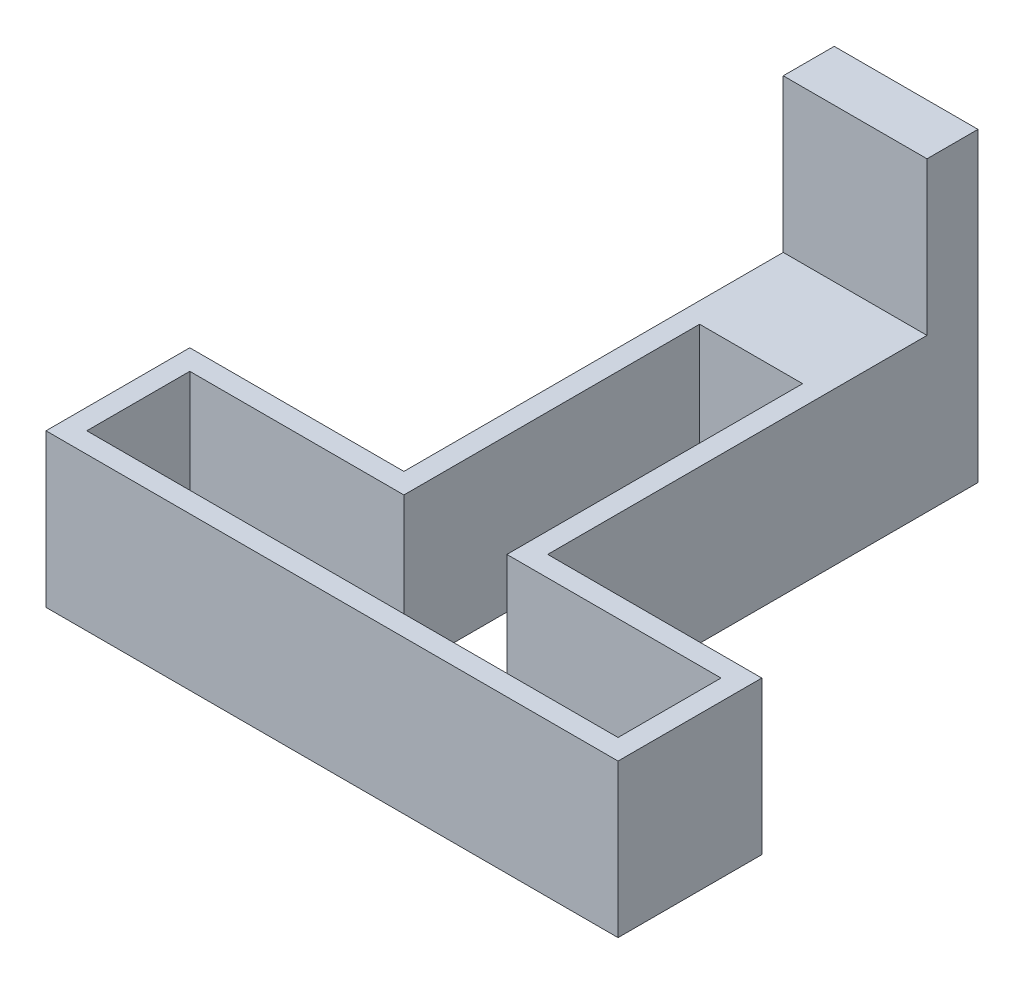
ISO-10303-21;
HEADER;
FILE_DESCRIPTION(('STEP AP214'),'2;1');
FILE_NAME('part.step','',(''),(''),'','','');
FILE_SCHEMA(('AUTOMOTIVE_DESIGN { 1 0 10303 214 1 1 1 1 }'));
ENDSEC;
DATA;
#1=APPLICATION_CONTEXT('core data for automotive mechanical design processes');
#2=APPLICATION_PROTOCOL_DEFINITION('international standard','automotive_design',2000,#1);
#3=PRODUCT_CONTEXT('',#1,'mechanical');
#4=PRODUCT('Part','Part','',(#3));
#5=PRODUCT_RELATED_PRODUCT_CATEGORY('part','',(#4));
#6=PRODUCT_DEFINITION_FORMATION('','',#4);
#7=PRODUCT_DEFINITION_CONTEXT('part definition',#1,'design');
#8=PRODUCT_DEFINITION('design','',#6,#7);
#9=PRODUCT_DEFINITION_SHAPE('','',#8);
#10=(LENGTH_UNIT() NAMED_UNIT(*) SI_UNIT(.MILLI.,.METRE.));
#11=(NAMED_UNIT(*) PLANE_ANGLE_UNIT() SI_UNIT($,.RADIAN.));
#12=(NAMED_UNIT(*) SI_UNIT($,.STERADIAN.) SOLID_ANGLE_UNIT());
#13=UNCERTAINTY_MEASURE_WITH_UNIT(LENGTH_MEASURE(1.E-05),#10,'distance_accuracy_value','');
#14=(GEOMETRIC_REPRESENTATION_CONTEXT(3) GLOBAL_UNCERTAINTY_ASSIGNED_CONTEXT((#13)) GLOBAL_UNIT_ASSIGNED_CONTEXT((#10,
#11,#12)) REPRESENTATION_CONTEXT('',''));
#15=CARTESIAN_POINT('',(0.,0.,0.));
#16=DIRECTION('',(0.,0.,1.));
#17=DIRECTION('',(1.,0.,0.));
#18=AXIS2_PLACEMENT_3D('',#15,#16,#17);
#19=CARTESIAN_POINT('',(0.,15.,0.));
#20=DIRECTION('',(0.,1.,0.));
#21=DIRECTION('',(0.,0.,1.));
#22=AXIS2_PLACEMENT_3D('',#19,#20,#21);
#23=PLANE('',#22);
#24=DIRECTION('',(0.,0.,1.));
#25=VECTOR('',#24,1.);
#26=CARTESIAN_POINT('',(21.,15.,-52.3));
#27=LINE('',#26,#25);
#28=CARTESIAN_POINT('',(21.,15.,-39.1));
#29=VERTEX_POINT('',#28);
#30=CARTESIAN_POINT('',(21.,15.,-10.1));
#31=VERTEX_POINT('',#30);
#32=EDGE_CURVE('E61',#29,#31,#27,.T.);
#33=ORIENTED_EDGE('',*,*,#32,.F.);
#34=DIRECTION('',(-1.,0.,0.));
#35=VECTOR('',#34,1.);
#36=CARTESIAN_POINT('',(19.,15.,-39.1));
#37=LINE('',#36,#35);
#38=CARTESIAN_POINT('',(31.1,15.,-39.1));
#39=VERTEX_POINT('',#38);
#40=EDGE_CURVE('E166',#39,#29,#37,.T.);
#41=ORIENTED_EDGE('',*,*,#40,.F.);
#42=DIRECTION('',(0.,0.,-1.));
#43=VECTOR('',#42,1.);
#44=CARTESIAN_POINT('',(31.1,15.,-10.1));
#45=LINE('',#44,#43);
#46=CARTESIAN_POINT('',(31.1,15.,-10.1));
#47=VERTEX_POINT('',#46);
#48=EDGE_CURVE('E178',#47,#39,#45,.T.);
#49=ORIENTED_EDGE('',*,*,#48,.F.);
#50=DIRECTION('',(-1.,0.,0.));
#51=VECTOR('',#50,1.);
#52=CARTESIAN_POINT('',(52.1,15.,-10.1));
#53=LINE('',#52,#51);
#54=CARTESIAN_POINT('',(52.1,15.,-10.1));
#55=VERTEX_POINT('',#54);
#56=EDGE_CURVE('E184',#55,#47,#53,.T.);
#57=ORIENTED_EDGE('',*,*,#56,.F.);
#58=DIRECTION('',(0.,0.,-1.));
#59=VECTOR('',#58,1.);
#60=CARTESIAN_POINT('',(52.1,15.,0.));
#61=LINE('',#60,#59);
#62=CARTESIAN_POINT('',(52.1,15.,0.));
#63=VERTEX_POINT('',#62);
#64=EDGE_CURVE('E188',#63,#55,#61,.T.);
#65=ORIENTED_EDGE('',*,*,#64,.F.);
#66=DIRECTION('',(1.,0.,0.));
#67=VECTOR('',#66,1.);
#68=CARTESIAN_POINT('',(0.,15.,0.));
#69=LINE('',#68,#67);
#70=CARTESIAN_POINT('',(0.,15.,0.));
#71=VERTEX_POINT('',#70);
#72=EDGE_CURVE('E296',#71,#63,#69,.T.);
#73=ORIENTED_EDGE('',*,*,#72,.F.);
#74=DIRECTION('',(0.,0.,1.));
#75=VECTOR('',#74,1.);
#76=CARTESIAN_POINT('',(0.,15.,-10.1));
#77=LINE('',#76,#75);
#78=CARTESIAN_POINT('',(0.,15.,-10.1));
#79=VERTEX_POINT('',#78);
#80=EDGE_CURVE('E214',#79,#71,#77,.T.);
#81=ORIENTED_EDGE('',*,*,#80,.F.);
#82=DIRECTION('',(-1.,0.,0.));
#83=VECTOR('',#82,1.);
#84=CARTESIAN_POINT('',(21.,15.,-10.1));
#85=LINE('',#84,#83);
#86=EDGE_CURVE('E186',#31,#79,#85,.T.);
#87=ORIENTED_EDGE('',*,*,#86,.F.);
#88=EDGE_LOOP('',(#33,#41,#49,#57,#65,#73,#81,#87));
#89=FACE_BOUND('',#88,.T.);
#90=DIRECTION('',(0.,0.,1.));
#91=VECTOR('',#90,1.);
#92=CARTESIAN_POINT('',(19.,15.,-54.3));
#93=LINE('',#92,#91);
#94=CARTESIAN_POINT('',(19.,15.,-49.3));
#95=VERTEX_POINT('',#94);
#96=CARTESIAN_POINT('',(19.,15.,-12.1));
#97=VERTEX_POINT('',#96);
#98=EDGE_CURVE('E242',#95,#97,#93,.T.);
#99=ORIENTED_EDGE('',*,*,#98,.T.);
#100=DIRECTION('',(-1.,0.,0.));
#101=VECTOR('',#100,1.);
#102=CARTESIAN_POINT('',(19.,15.,-12.1));
#103=LINE('',#102,#101);
#104=CARTESIAN_POINT('',(-2.,15.,-12.1));
#105=VERTEX_POINT('',#104);
#106=EDGE_CURVE('E228',#97,#105,#103,.T.);
#107=ORIENTED_EDGE('',*,*,#106,.T.);
#108=DIRECTION('',(0.,0.,1.));
#109=VECTOR('',#108,1.);
#110=CARTESIAN_POINT('',(-2.,15.,-12.1));
#111=LINE('',#110,#109);
#112=CARTESIAN_POINT('',(-2.,15.,2.));
#113=VERTEX_POINT('',#112);
#114=EDGE_CURVE('E231',#105,#113,#111,.T.);
#115=ORIENTED_EDGE('',*,*,#114,.T.);
#116=DIRECTION('',(1.,0.,0.));
#117=VECTOR('',#116,1.);
#118=CARTESIAN_POINT('',(-2.,15.,2.));
#119=LINE('',#118,#117);
#120=CARTESIAN_POINT('',(54.1,15.,2.));
#121=VERTEX_POINT('',#120);
#122=EDGE_CURVE('E234',#113,#121,#119,.T.);
#123=ORIENTED_EDGE('',*,*,#122,.T.);
#124=DIRECTION('',(0.,0.,-1.));
#125=VECTOR('',#124,1.);
#126=CARTESIAN_POINT('',(54.1,15.,2.));
#127=LINE('',#126,#125);
#128=CARTESIAN_POINT('',(54.1,15.,-12.1));
#129=VERTEX_POINT('',#128);
#130=EDGE_CURVE('E236',#121,#129,#127,.T.);
#131=ORIENTED_EDGE('',*,*,#130,.T.);
#132=DIRECTION('',(-1.,0.,0.));
#133=VECTOR('',#132,1.);
#134=CARTESIAN_POINT('',(54.1,15.,-12.1));
#135=LINE('',#134,#133);
#136=CARTESIAN_POINT('',(33.1,15.,-12.1));
#137=VERTEX_POINT('',#136);
#138=EDGE_CURVE('E238',#129,#137,#135,.T.);
#139=ORIENTED_EDGE('',*,*,#138,.T.);
#140=DIRECTION('',(0.,0.,-1.));
#141=VECTOR('',#140,1.);
#142=CARTESIAN_POINT('',(33.1,15.,-12.1));
#143=LINE('',#142,#141);
#144=CARTESIAN_POINT('',(33.1,15.,-49.3));
#145=VERTEX_POINT('',#144);
#146=EDGE_CURVE('E240',#137,#145,#143,.T.);
#147=ORIENTED_EDGE('',*,*,#146,.T.);
#148=DIRECTION('',(1.,0.,0.));
#149=VECTOR('',#148,1.);
#150=CARTESIAN_POINT('',(19.,15.,-49.3));
#151=LINE('',#150,#149);
#152=EDGE_CURVE('E47',#95,#145,#151,.T.);
#153=ORIENTED_EDGE('',*,*,#152,.F.);
#154=EDGE_LOOP('',(#99,#107,#115,#123,#131,#139,#147,#153));
#155=FACE_BOUND('',#154,.T.);
#156=ADVANCED_FACE('F39',(#89,#155),#23,.T.);
#157=CARTESIAN_POINT('',(0.,0.,0.));
#158=DIRECTION('',(0.,1.,0.));
#159=DIRECTION('',(0.,0.,1.));
#160=AXIS2_PLACEMENT_3D('',#157,#158,#159);
#161=PLANE('',#160);
#162=DIRECTION('',(-1.,0.,0.));
#163=VECTOR('',#162,1.);
#164=CARTESIAN_POINT('',(19.,0.,-39.1));
#165=LINE('',#164,#163);
#166=CARTESIAN_POINT('',(31.1,0.,-39.1));
#167=VERTEX_POINT('',#166);
#168=CARTESIAN_POINT('',(21.,0.,-39.1));
#169=VERTEX_POINT('',#168);
#170=EDGE_CURVE('E168',#167,#169,#165,.T.);
#171=ORIENTED_EDGE('',*,*,#170,.T.);
#172=DIRECTION('',(0.,0.,1.));
#173=VECTOR('',#172,1.);
#174=CARTESIAN_POINT('',(21.,0.,-52.3));
#175=LINE('',#174,#173);
#176=CARTESIAN_POINT('',(21.,0.,-10.1));
#177=VERTEX_POINT('',#176);
#178=EDGE_CURVE('E209',#169,#177,#175,.T.);
#179=ORIENTED_EDGE('',*,*,#178,.T.);
#180=DIRECTION('',(-1.,0.,0.));
#181=VECTOR('',#180,1.);
#182=CARTESIAN_POINT('',(21.,0.,-10.1));
#183=LINE('',#182,#181);
#184=CARTESIAN_POINT('',(0.,0.,-10.1));
#185=VERTEX_POINT('',#184);
#186=EDGE_CURVE('E211',#177,#185,#183,.T.);
#187=ORIENTED_EDGE('',*,*,#186,.T.);
#188=DIRECTION('',(0.,0.,1.));
#189=VECTOR('',#188,1.);
#190=CARTESIAN_POINT('',(0.,0.,-10.1));
#191=LINE('',#190,#189);
#192=CARTESIAN_POINT('',(0.,0.,0.));
#193=VERTEX_POINT('',#192);
#194=EDGE_CURVE('E194',#185,#193,#191,.T.);
#195=ORIENTED_EDGE('',*,*,#194,.T.);
#196=DIRECTION('',(1.,0.,0.));
#197=VECTOR('',#196,1.);
#198=CARTESIAN_POINT('',(0.,0.,0.));
#199=LINE('',#198,#197);
#200=CARTESIAN_POINT('',(52.1,0.,0.));
#201=VERTEX_POINT('',#200);
#202=EDGE_CURVE('E197',#193,#201,#199,.T.);
#203=ORIENTED_EDGE('',*,*,#202,.T.);
#204=DIRECTION('',(0.,0.,-1.));
#205=VECTOR('',#204,1.);
#206=CARTESIAN_POINT('',(52.1,0.,0.));
#207=LINE('',#206,#205);
#208=CARTESIAN_POINT('',(52.1,0.,-10.1));
#209=VERTEX_POINT('',#208);
#210=EDGE_CURVE('E201',#201,#209,#207,.T.);
#211=ORIENTED_EDGE('',*,*,#210,.T.);
#212=DIRECTION('',(-1.,0.,0.));
#213=VECTOR('',#212,1.);
#214=CARTESIAN_POINT('',(52.1,0.,-10.1));
#215=LINE('',#214,#213);
#216=CARTESIAN_POINT('',(31.1,0.,-10.1));
#217=VERTEX_POINT('',#216);
#218=EDGE_CURVE('E204',#209,#217,#215,.T.);
#219=ORIENTED_EDGE('',*,*,#218,.T.);
#220=DIRECTION('',(0.,0.,-1.));
#221=VECTOR('',#220,1.);
#222=CARTESIAN_POINT('',(31.1,0.,-10.1));
#223=LINE('',#222,#221);
#224=EDGE_CURVE('E207',#217,#167,#223,.T.);
#225=ORIENTED_EDGE('',*,*,#224,.T.);
#226=EDGE_LOOP('',(#171,#179,#187,#195,#203,#211,#219,#225));
#227=FACE_BOUND('',#226,.T.);
#228=DIRECTION('',(-1.,0.,0.));
#229=VECTOR('',#228,1.);
#230=CARTESIAN_POINT('',(19.,0.,-12.1));
#231=LINE('',#230,#229);
#232=CARTESIAN_POINT('',(19.,0.,-12.1));
#233=VERTEX_POINT('',#232);
#234=CARTESIAN_POINT('',(-2.,0.,-12.1));
#235=VERTEX_POINT('',#234);
#236=EDGE_CURVE('E227',#233,#235,#231,.T.);
#237=ORIENTED_EDGE('',*,*,#236,.F.);
#238=DIRECTION('',(0.,0.,1.));
#239=VECTOR('',#238,1.);
#240=CARTESIAN_POINT('',(19.,0.,-54.3));
#241=LINE('',#240,#239);
#242=CARTESIAN_POINT('',(19.,0.,-54.3));
#243=VERTEX_POINT('',#242);
#244=EDGE_CURVE('E232',#243,#233,#241,.T.);
#245=ORIENTED_EDGE('',*,*,#244,.F.);
#246=DIRECTION('',(-1.,0.,0.));
#247=VECTOR('',#246,1.);
#248=CARTESIAN_POINT('',(33.1,0.,-54.3));
#249=LINE('',#248,#247);
#250=CARTESIAN_POINT('',(33.1,0.,-54.3));
#251=VERTEX_POINT('',#250);
#252=EDGE_CURVE('E257',#251,#243,#249,.T.);
#253=ORIENTED_EDGE('',*,*,#252,.F.);
#254=DIRECTION('',(0.,0.,-1.));
#255=VECTOR('',#254,1.);
#256=CARTESIAN_POINT('',(33.1,0.,-12.1));
#257=LINE('',#256,#255);
#258=CARTESIAN_POINT('',(33.1,0.,-12.1));
#259=VERTEX_POINT('',#258);
#260=EDGE_CURVE('E255',#259,#251,#257,.T.);
#261=ORIENTED_EDGE('',*,*,#260,.F.);
#262=DIRECTION('',(-1.,0.,0.));
#263=VECTOR('',#262,1.);
#264=CARTESIAN_POINT('',(54.1,0.,-12.1));
#265=LINE('',#264,#263);
#266=CARTESIAN_POINT('',(54.1,0.,-12.1));
#267=VERTEX_POINT('',#266);
#268=EDGE_CURVE('E253',#267,#259,#265,.T.);
#269=ORIENTED_EDGE('',*,*,#268,.F.);
#270=DIRECTION('',(0.,0.,-1.));
#271=VECTOR('',#270,1.);
#272=CARTESIAN_POINT('',(54.1,0.,2.));
#273=LINE('',#272,#271);
#274=CARTESIAN_POINT('',(54.1,0.,2.));
#275=VERTEX_POINT('',#274);
#276=EDGE_CURVE('E251',#275,#267,#273,.T.);
#277=ORIENTED_EDGE('',*,*,#276,.F.);
#278=DIRECTION('',(1.,0.,0.));
#279=VECTOR('',#278,1.);
#280=CARTESIAN_POINT('',(-2.,0.,2.));
#281=LINE('',#280,#279);
#282=CARTESIAN_POINT('',(-2.,0.,2.));
#283=VERTEX_POINT('',#282);
#284=EDGE_CURVE('E249',#283,#275,#281,.T.);
#285=ORIENTED_EDGE('',*,*,#284,.F.);
#286=DIRECTION('',(0.,0.,1.));
#287=VECTOR('',#286,1.);
#288=CARTESIAN_POINT('',(-2.,0.,-12.1));
#289=LINE('',#288,#287);
#290=EDGE_CURVE('E247',#235,#283,#289,.T.);
#291=ORIENTED_EDGE('',*,*,#290,.F.);
#292=EDGE_LOOP('',(#237,#245,#253,#261,#269,#277,#285,#291));
#293=FACE_BOUND('',#292,.T.);
#294=ADVANCED_FACE('F308',(#227,#293),#161,.F.);
#295=CARTESIAN_POINT('',(19.,15.,-12.1));
#296=DIRECTION('',(0.,0.,1.));
#297=DIRECTION('',(1.,0.,0.));
#298=AXIS2_PLACEMENT_3D('',#295,#296,#297);
#299=PLANE('',#298);
#300=ORIENTED_EDGE('',*,*,#236,.T.);
#301=DIRECTION('',(0.,-1.,0.));
#302=VECTOR('',#301,1.);
#303=CARTESIAN_POINT('',(-2.,15.,-12.1));
#304=LINE('',#303,#302);
#305=EDGE_CURVE('E279',#105,#235,#304,.T.);
#306=ORIENTED_EDGE('',*,*,#305,.F.);
#307=ORIENTED_EDGE('',*,*,#106,.F.);
#308=DIRECTION('',(0.,-1.,0.));
#309=VECTOR('',#308,1.);
#310=CARTESIAN_POINT('',(19.,15.,-12.1));
#311=LINE('',#310,#309);
#312=EDGE_CURVE('E244',#97,#233,#311,.T.);
#313=ORIENTED_EDGE('',*,*,#312,.T.);
#314=EDGE_LOOP('',(#300,#306,#307,#313));
#315=FACE_BOUND('',#314,.T.);
#316=ADVANCED_FACE('F41',(#315),#299,.F.);
#317=CARTESIAN_POINT('',(-2.,15.,-12.1));
#318=DIRECTION('',(1.,0.,0.));
#319=DIRECTION('',(0.,0.,-1.));
#320=AXIS2_PLACEMENT_3D('',#317,#318,#319);
#321=PLANE('',#320);
#322=ORIENTED_EDGE('',*,*,#290,.T.);
#323=DIRECTION('',(0.,-1.,0.));
#324=VECTOR('',#323,1.);
#325=CARTESIAN_POINT('',(-2.,15.,2.));
#326=LINE('',#325,#324);
#327=EDGE_CURVE('E277',#113,#283,#326,.T.);
#328=ORIENTED_EDGE('',*,*,#327,.F.);
#329=ORIENTED_EDGE('',*,*,#114,.F.);
#330=ORIENTED_EDGE('',*,*,#305,.T.);
#331=EDGE_LOOP('',(#322,#328,#329,#330));
#332=FACE_BOUND('',#331,.T.);
#333=ADVANCED_FACE('F355',(#332),#321,.F.);
#334=CARTESIAN_POINT('',(-2.,15.,2.));
#335=DIRECTION('',(0.,0.,-1.));
#336=DIRECTION('',(-1.,0.,0.));
#337=AXIS2_PLACEMENT_3D('',#334,#335,#336);
#338=PLANE('',#337);
#339=ORIENTED_EDGE('',*,*,#284,.T.);
#340=DIRECTION('',(0.,-1.,0.));
#341=VECTOR('',#340,1.);
#342=CARTESIAN_POINT('',(54.1,15.,2.));
#343=LINE('',#342,#341);
#344=EDGE_CURVE('E274',#121,#275,#343,.T.);
#345=ORIENTED_EDGE('',*,*,#344,.F.);
#346=ORIENTED_EDGE('',*,*,#122,.F.);
#347=ORIENTED_EDGE('',*,*,#327,.T.);
#348=EDGE_LOOP('',(#339,#345,#346,#347));
#349=FACE_BOUND('',#348,.T.);
#350=ADVANCED_FACE('F358',(#349),#338,.F.);
#351=CARTESIAN_POINT('',(54.1,15.,2.));
#352=DIRECTION('',(-1.,0.,0.));
#353=DIRECTION('',(0.,0.,1.));
#354=AXIS2_PLACEMENT_3D('',#351,#352,#353);
#355=PLANE('',#354);
#356=ORIENTED_EDGE('',*,*,#276,.T.);
#357=DIRECTION('',(0.,-1.,0.));
#358=VECTOR('',#357,1.);
#359=CARTESIAN_POINT('',(54.1,15.,-12.1));
#360=LINE('',#359,#358);
#361=EDGE_CURVE('E271',#129,#267,#360,.T.);
#362=ORIENTED_EDGE('',*,*,#361,.F.);
#363=ORIENTED_EDGE('',*,*,#130,.F.);
#364=ORIENTED_EDGE('',*,*,#344,.T.);
#365=EDGE_LOOP('',(#356,#362,#363,#364));
#366=FACE_BOUND('',#365,.T.);
#367=ADVANCED_FACE('F363',(#366),#355,.F.);
#368=CARTESIAN_POINT('',(54.1,15.,-12.1));
#369=DIRECTION('',(0.,0.,1.));
#370=DIRECTION('',(1.,0.,0.));
#371=AXIS2_PLACEMENT_3D('',#368,#369,#370);
#372=PLANE('',#371);
#373=ORIENTED_EDGE('',*,*,#268,.T.);
#374=DIRECTION('',(0.,-1.,0.));
#375=VECTOR('',#374,1.);
#376=CARTESIAN_POINT('',(33.1,15.,-12.1));
#377=LINE('',#376,#375);
#378=EDGE_CURVE('E268',#137,#259,#377,.T.);
#379=ORIENTED_EDGE('',*,*,#378,.F.);
#380=ORIENTED_EDGE('',*,*,#138,.F.);
#381=ORIENTED_EDGE('',*,*,#361,.T.);
#382=EDGE_LOOP('',(#373,#379,#380,#381));
#383=FACE_BOUND('',#382,.T.);
#384=ADVANCED_FACE('F367',(#383),#372,.F.);
#385=CARTESIAN_POINT('',(33.1,15.,-12.1));
#386=DIRECTION('',(-1.,0.,0.));
#387=DIRECTION('',(0.,0.,1.));
#388=AXIS2_PLACEMENT_3D('',#385,#386,#387);
#389=PLANE('',#388);
#390=ORIENTED_EDGE('',*,*,#260,.T.);
#391=DIRECTION('',(0.,-1.,0.));
#392=VECTOR('',#391,1.);
#393=CARTESIAN_POINT('',(33.1,15.,-54.3));
#394=LINE('',#393,#392);
#395=CARTESIAN_POINT('',(33.1,30.,-54.3));
#396=VERTEX_POINT('',#395);
#397=EDGE_CURVE('E265',#396,#251,#394,.T.);
#398=ORIENTED_EDGE('',*,*,#397,.F.);
#399=DIRECTION('',(0.,0.,-1.));
#400=VECTOR('',#399,1.);
#401=CARTESIAN_POINT('',(33.1,30.,-54.3));
#402=LINE('',#401,#400);
#403=CARTESIAN_POINT('',(33.1,30.,-49.3));
#404=VERTEX_POINT('',#403);
#405=EDGE_CURVE('E327',#404,#396,#402,.T.);
#406=ORIENTED_EDGE('',*,*,#405,.F.);
#407=DIRECTION('',(0.,-1.,0.));
#408=VECTOR('',#407,1.);
#409=CARTESIAN_POINT('',(33.1,30.,-49.3));
#410=LINE('',#409,#408);
#411=EDGE_CURVE('E292',#404,#145,#410,.T.);
#412=ORIENTED_EDGE('',*,*,#411,.T.);
#413=ORIENTED_EDGE('',*,*,#146,.F.);
#414=ORIENTED_EDGE('',*,*,#378,.T.);
#415=EDGE_LOOP('',(#390,#398,#406,#412,#413,#414));
#416=FACE_BOUND('',#415,.T.);
#417=ADVANCED_FACE('F343',(#416),#389,.F.);
#418=CARTESIAN_POINT('',(33.1,15.,-54.3));
#419=DIRECTION('',(0.,0.,1.));
#420=DIRECTION('',(1.,0.,0.));
#421=AXIS2_PLACEMENT_3D('',#418,#419,#420);
#422=PLANE('',#421);
#423=ORIENTED_EDGE('',*,*,#397,.T.);
#424=ORIENTED_EDGE('',*,*,#252,.T.);
#425=DIRECTION('',(0.,-1.,0.));
#426=VECTOR('',#425,1.);
#427=CARTESIAN_POINT('',(19.,15.,-54.3));
#428=LINE('',#427,#426);
#429=CARTESIAN_POINT('',(19.,30.,-54.3));
#430=VERTEX_POINT('',#429);
#431=EDGE_CURVE('E263',#430,#243,#428,.T.);
#432=ORIENTED_EDGE('',*,*,#431,.F.);
#433=DIRECTION('',(-1.,0.,0.));
#434=VECTOR('',#433,1.);
#435=CARTESIAN_POINT('',(19.,30.,-54.3));
#436=LINE('',#435,#434);
#437=EDGE_CURVE('E290',#396,#430,#436,.T.);
#438=ORIENTED_EDGE('',*,*,#437,.F.);
#439=EDGE_LOOP('',(#423,#424,#432,#438));
#440=FACE_BOUND('',#439,.T.);
#441=ADVANCED_FACE('F346',(#440),#422,.F.);
#442=CARTESIAN_POINT('',(19.,15.,-54.3));
#443=DIRECTION('',(1.,0.,0.));
#444=DIRECTION('',(0.,0.,-1.));
#445=AXIS2_PLACEMENT_3D('',#442,#443,#444);
#446=PLANE('',#445);
#447=ORIENTED_EDGE('',*,*,#312,.F.);
#448=ORIENTED_EDGE('',*,*,#98,.F.);
#449=DIRECTION('',(0.,-1.,0.));
#450=VECTOR('',#449,1.);
#451=CARTESIAN_POINT('',(19.,30.,-49.3));
#452=LINE('',#451,#450);
#453=CARTESIAN_POINT('',(19.,30.,-49.3));
#454=VERTEX_POINT('',#453);
#455=EDGE_CURVE('E198',#454,#95,#452,.T.);
#456=ORIENTED_EDGE('',*,*,#455,.F.);
#457=DIRECTION('',(0.,0.,1.));
#458=VECTOR('',#457,1.);
#459=CARTESIAN_POINT('',(19.,30.,-54.3));
#460=LINE('',#459,#458);
#461=EDGE_CURVE('E173',#430,#454,#460,.T.);
#462=ORIENTED_EDGE('',*,*,#461,.F.);
#463=ORIENTED_EDGE('',*,*,#431,.T.);
#464=ORIENTED_EDGE('',*,*,#244,.T.);
#465=EDGE_LOOP('',(#447,#448,#456,#462,#463,#464));
#466=FACE_BOUND('',#465,.T.);
#467=ADVANCED_FACE('F339',(#466),#446,.F.);
#468=CARTESIAN_POINT('',(0.,15.,-10.1));
#469=DIRECTION('',(1.,0.,0.));
#470=DIRECTION('',(0.,0.,-1.));
#471=AXIS2_PLACEMENT_3D('',#468,#469,#470);
#472=PLANE('',#471);
#473=ORIENTED_EDGE('',*,*,#194,.F.);
#474=DIRECTION('',(0.,-1.,0.));
#475=VECTOR('',#474,1.);
#476=CARTESIAN_POINT('',(0.,15.,-10.1));
#477=LINE('',#476,#475);
#478=EDGE_CURVE('E193',#79,#185,#477,.T.);
#479=ORIENTED_EDGE('',*,*,#478,.F.);
#480=ORIENTED_EDGE('',*,*,#80,.T.);
#481=DIRECTION('',(0.,-1.,0.));
#482=VECTOR('',#481,1.);
#483=CARTESIAN_POINT('',(0.,15.,0.));
#484=LINE('',#483,#482);
#485=EDGE_CURVE('E224',#71,#193,#484,.T.);
#486=ORIENTED_EDGE('',*,*,#485,.T.);
#487=EDGE_LOOP('',(#473,#479,#480,#486));
#488=FACE_BOUND('',#487,.T.);
#489=ADVANCED_FACE('F314',(#488),#472,.T.);
#490=CARTESIAN_POINT('',(0.,15.,0.));
#491=DIRECTION('',(0.,0.,-1.));
#492=DIRECTION('',(-1.,0.,0.));
#493=AXIS2_PLACEMENT_3D('',#490,#491,#492);
#494=PLANE('',#493);
#495=ORIENTED_EDGE('',*,*,#202,.F.);
#496=ORIENTED_EDGE('',*,*,#485,.F.);
#497=ORIENTED_EDGE('',*,*,#72,.T.);
#498=DIRECTION('',(0.,-1.,0.));
#499=VECTOR('',#498,1.);
#500=CARTESIAN_POINT('',(52.1,15.,0.));
#501=LINE('',#500,#499);
#502=EDGE_CURVE('E222',#63,#201,#501,.T.);
#503=ORIENTED_EDGE('',*,*,#502,.T.);
#504=EDGE_LOOP('',(#495,#496,#497,#503));
#505=FACE_BOUND('',#504,.T.);
#506=ADVANCED_FACE('F312',(#505),#494,.T.);
#507=CARTESIAN_POINT('',(52.1,15.,0.));
#508=DIRECTION('',(-1.,0.,0.));
#509=DIRECTION('',(0.,0.,1.));
#510=AXIS2_PLACEMENT_3D('',#507,#508,#509);
#511=PLANE('',#510);
#512=ORIENTED_EDGE('',*,*,#210,.F.);
#513=ORIENTED_EDGE('',*,*,#502,.F.);
#514=ORIENTED_EDGE('',*,*,#64,.T.);
#515=DIRECTION('',(0.,-1.,0.));
#516=VECTOR('',#515,1.);
#517=CARTESIAN_POINT('',(52.1,15.,-10.1));
#518=LINE('',#517,#516);
#519=EDGE_CURVE('E220',#55,#209,#518,.T.);
#520=ORIENTED_EDGE('',*,*,#519,.T.);
#521=EDGE_LOOP('',(#512,#513,#514,#520));
#522=FACE_BOUND('',#521,.T.);
#523=ADVANCED_FACE('F302',(#522),#511,.T.);
#524=CARTESIAN_POINT('',(52.1,15.,-10.1));
#525=DIRECTION('',(0.,0.,1.));
#526=DIRECTION('',(1.,0.,0.));
#527=AXIS2_PLACEMENT_3D('',#524,#525,#526);
#528=PLANE('',#527);
#529=ORIENTED_EDGE('',*,*,#218,.F.);
#530=ORIENTED_EDGE('',*,*,#519,.F.);
#531=ORIENTED_EDGE('',*,*,#56,.T.);
#532=DIRECTION('',(0.,-1.,0.));
#533=VECTOR('',#532,1.);
#534=CARTESIAN_POINT('',(31.1,15.,-10.1));
#535=LINE('',#534,#533);
#536=EDGE_CURVE('E183',#47,#217,#535,.T.);
#537=ORIENTED_EDGE('',*,*,#536,.T.);
#538=EDGE_LOOP('',(#529,#530,#531,#537));
#539=FACE_BOUND('',#538,.T.);
#540=ADVANCED_FACE('F306',(#539),#528,.T.);
#541=CARTESIAN_POINT('',(31.1,15.,-10.1));
#542=DIRECTION('',(-1.,0.,0.));
#543=DIRECTION('',(0.,0.,1.));
#544=AXIS2_PLACEMENT_3D('',#541,#542,#543);
#545=PLANE('',#544);
#546=DIRECTION('',(0.,1.,0.));
#547=VECTOR('',#546,1.);
#548=CARTESIAN_POINT('',(31.1,15.,-39.1));
#549=LINE('',#548,#547);
#550=EDGE_CURVE('E163',#167,#39,#549,.T.);
#551=ORIENTED_EDGE('',*,*,#550,.F.);
#552=ORIENTED_EDGE('',*,*,#224,.F.);
#553=ORIENTED_EDGE('',*,*,#536,.F.);
#554=ORIENTED_EDGE('',*,*,#48,.T.);
#555=EDGE_LOOP('',(#551,#552,#553,#554));
#556=FACE_BOUND('',#555,.T.);
#557=ADVANCED_FACE('F182',(#556),#545,.T.);
#558=CARTESIAN_POINT('',(21.,15.,-52.3));
#559=DIRECTION('',(1.,0.,0.));
#560=DIRECTION('',(0.,0.,-1.));
#561=AXIS2_PLACEMENT_3D('',#558,#559,#560);
#562=PLANE('',#561);
#563=DIRECTION('',(0.,-1.,0.));
#564=VECTOR('',#563,1.);
#565=CARTESIAN_POINT('',(21.,15.,-39.1));
#566=LINE('',#565,#564);
#567=EDGE_CURVE('E11',#29,#169,#566,.T.);
#568=ORIENTED_EDGE('',*,*,#567,.F.);
#569=ORIENTED_EDGE('',*,*,#32,.T.);
#570=DIRECTION('',(0.,-1.,0.));
#571=VECTOR('',#570,1.);
#572=CARTESIAN_POINT('',(21.,15.,-10.1));
#573=LINE('',#572,#571);
#574=EDGE_CURVE('E217',#31,#177,#573,.T.);
#575=ORIENTED_EDGE('',*,*,#574,.T.);
#576=ORIENTED_EDGE('',*,*,#178,.F.);
#577=EDGE_LOOP('',(#568,#569,#575,#576));
#578=FACE_BOUND('',#577,.T.);
#579=ADVANCED_FACE('F321',(#578),#562,.T.);
#580=CARTESIAN_POINT('',(21.,15.,-10.1));
#581=DIRECTION('',(0.,0.,1.));
#582=DIRECTION('',(1.,0.,0.));
#583=AXIS2_PLACEMENT_3D('',#580,#581,#582);
#584=PLANE('',#583);
#585=ORIENTED_EDGE('',*,*,#186,.F.);
#586=ORIENTED_EDGE('',*,*,#574,.F.);
#587=ORIENTED_EDGE('',*,*,#86,.T.);
#588=ORIENTED_EDGE('',*,*,#478,.T.);
#589=EDGE_LOOP('',(#585,#586,#587,#588));
#590=FACE_BOUND('',#589,.T.);
#591=ADVANCED_FACE('F319',(#590),#584,.T.);
#592=CARTESIAN_POINT('',(19.,30.,-49.3));
#593=DIRECTION('',(0.,0.,-1.));
#594=DIRECTION('',(-1.,0.,0.));
#595=AXIS2_PLACEMENT_3D('',#592,#593,#594);
#596=PLANE('',#595);
#597=ORIENTED_EDGE('',*,*,#455,.T.);
#598=ORIENTED_EDGE('',*,*,#152,.T.);
#599=ORIENTED_EDGE('',*,*,#411,.F.);
#600=DIRECTION('',(1.,0.,0.));
#601=VECTOR('',#600,1.);
#602=CARTESIAN_POINT('',(19.,30.,-49.3));
#603=LINE('',#602,#601);
#604=EDGE_CURVE('E326',#454,#404,#603,.T.);
#605=ORIENTED_EDGE('',*,*,#604,.F.);
#606=EDGE_LOOP('',(#597,#598,#599,#605));
#607=FACE_BOUND('',#606,.T.);
#608=ADVANCED_FACE('F340',(#607),#596,.F.);
#609=CARTESIAN_POINT('',(0.,30.,0.));
#610=DIRECTION('',(0.,1.,0.));
#611=DIRECTION('',(0.,0.,1.));
#612=AXIS2_PLACEMENT_3D('',#609,#610,#611);
#613=PLANE('',#612);
#614=ORIENTED_EDGE('',*,*,#461,.T.);
#615=ORIENTED_EDGE('',*,*,#604,.T.);
#616=ORIENTED_EDGE('',*,*,#405,.T.);
#617=ORIENTED_EDGE('',*,*,#437,.T.);
#618=EDGE_LOOP('',(#614,#615,#616,#617));
#619=FACE_BOUND('',#618,.T.);
#620=ADVANCED_FACE('F334',(#619),#613,.T.);
#621=CARTESIAN_POINT('',(19.,35.732824216686,-39.1));
#622=DIRECTION('',(0.,0.,1.));
#623=DIRECTION('',(1.,0.,0.));
#624=AXIS2_PLACEMENT_3D('',#621,#622,#623);
#625=PLANE('',#624);
#626=ORIENTED_EDGE('',*,*,#170,.F.);
#627=ORIENTED_EDGE('',*,*,#550,.T.);
#628=ORIENTED_EDGE('',*,*,#40,.T.);
#629=ORIENTED_EDGE('',*,*,#567,.T.);
#630=EDGE_LOOP('',(#626,#627,#628,#629));
#631=FACE_BOUND('',#630,.T.);
#632=ADVANCED_FACE('F165',(#631),#625,.T.);
#633=CLOSED_SHELL('',(#156,#294,#316,#333,#350,#367,#384,#417,#441,#467,#489,#506,#523,#540,
#557,#579,#591,#608,#620,#632));
#634=MANIFOLD_SOLID_BREP('B2',#633);
#635=ADVANCED_BREP_SHAPE_REPRESENTATION('',(#18,#634),#14);
#636=SHAPE_DEFINITION_REPRESENTATION(#9,#635);
ENDSEC;
END-ISO-10303-21;
